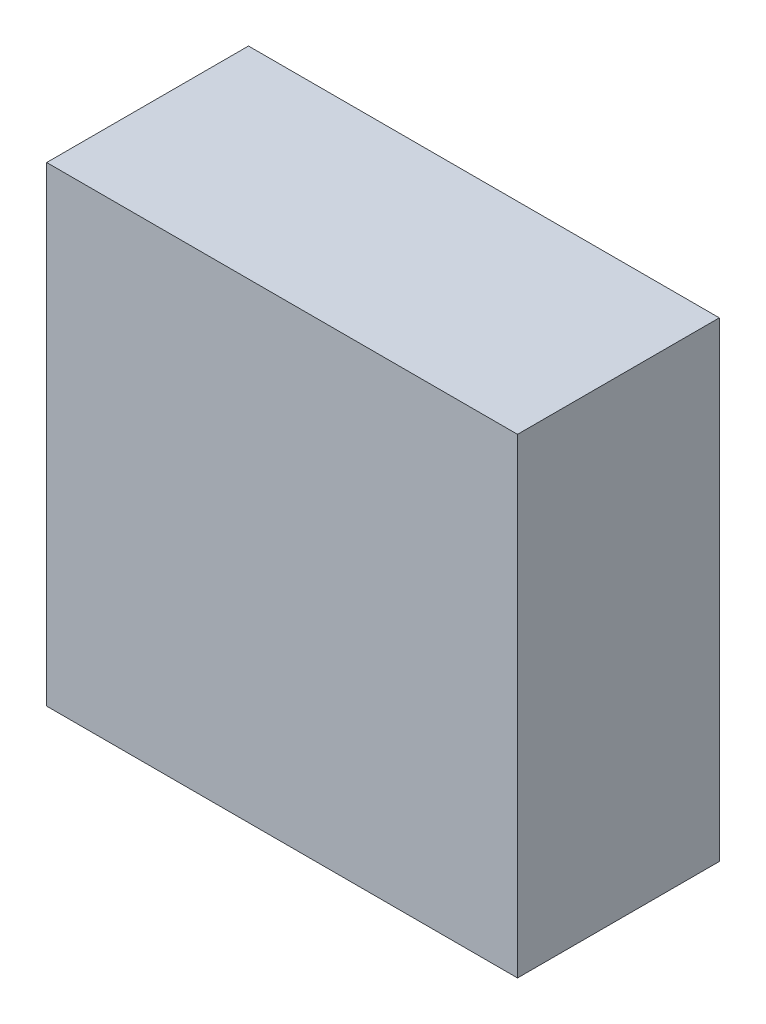
ISO-10303-21;
HEADER;
FILE_DESCRIPTION(('STEP AP214'),'2;1');
FILE_NAME('part.step','',(''),(''),'','','');
FILE_SCHEMA(('AUTOMOTIVE_DESIGN { 1 0 10303 214 1 1 1 1 }'));
ENDSEC;
DATA;
#1=APPLICATION_CONTEXT('core data for automotive mechanical design processes');
#2=APPLICATION_PROTOCOL_DEFINITION('international standard','automotive_design',2000,#1);
#3=PRODUCT_CONTEXT('',#1,'mechanical');
#4=PRODUCT('Part','Part','',(#3));
#5=PRODUCT_RELATED_PRODUCT_CATEGORY('part','',(#4));
#6=PRODUCT_DEFINITION_FORMATION('','',#4);
#7=PRODUCT_DEFINITION_CONTEXT('part definition',#1,'design');
#8=PRODUCT_DEFINITION('design','',#6,#7);
#9=PRODUCT_DEFINITION_SHAPE('','',#8);
#10=(LENGTH_UNIT() NAMED_UNIT(*) SI_UNIT(.MILLI.,.METRE.));
#11=(NAMED_UNIT(*) PLANE_ANGLE_UNIT() SI_UNIT($,.RADIAN.));
#12=(NAMED_UNIT(*) SI_UNIT($,.STERADIAN.) SOLID_ANGLE_UNIT());
#13=UNCERTAINTY_MEASURE_WITH_UNIT(LENGTH_MEASURE(1.E-05),#10,'distance_accuracy_value','');
#14=(GEOMETRIC_REPRESENTATION_CONTEXT(3) GLOBAL_UNCERTAINTY_ASSIGNED_CONTEXT((#13)) GLOBAL_UNIT_ASSIGNED_CONTEXT((#10,
#11,#12)) REPRESENTATION_CONTEXT('',''));
#15=CARTESIAN_POINT('',(0.,0.,0.));
#16=DIRECTION('',(0.,0.,1.));
#17=DIRECTION('',(1.,0.,0.));
#18=AXIS2_PLACEMENT_3D('',#15,#16,#17);
#19=CARTESIAN_POINT('',(0.,0.,15.));
#20=DIRECTION('',(0.,0.,1.));
#21=DIRECTION('',(1.,0.,0.));
#22=AXIS2_PLACEMENT_3D('',#19,#20,#21);
#23=PLANE('',#22);
#24=DIRECTION('',(-1.,0.,0.));
#25=VECTOR('',#24,1.);
#26=CARTESIAN_POINT('',(0.,-17.5,15.));
#27=LINE('',#26,#25);
#28=CARTESIAN_POINT('',(17.5,-17.5,15.));
#29=VERTEX_POINT('',#28);
#30=CARTESIAN_POINT('',(-17.5,-17.5,15.));
#31=VERTEX_POINT('',#30);
#32=EDGE_CURVE('E11',#29,#31,#27,.T.);
#33=ORIENTED_EDGE('',*,*,#32,.F.);
#34=DIRECTION('',(0.,-1.,0.));
#35=VECTOR('',#34,1.);
#36=CARTESIAN_POINT('',(17.5,0.,15.));
#37=LINE('',#36,#35);
#38=CARTESIAN_POINT('',(17.5,17.5,15.));
#39=VERTEX_POINT('',#38);
#40=EDGE_CURVE('E61',#39,#29,#37,.T.);
#41=ORIENTED_EDGE('',*,*,#40,.F.);
#42=DIRECTION('',(1.,0.,0.));
#43=VECTOR('',#42,1.);
#44=CARTESIAN_POINT('',(0.,17.5,15.));
#45=LINE('',#44,#43);
#46=CARTESIAN_POINT('',(-17.5,17.5,15.));
#47=VERTEX_POINT('',#46);
#48=EDGE_CURVE('E87',#47,#39,#45,.T.);
#49=ORIENTED_EDGE('',*,*,#48,.F.);
#50=DIRECTION('',(0.,1.,0.));
#51=VECTOR('',#50,1.);
#52=CARTESIAN_POINT('',(-17.5,0.,15.));
#53=LINE('',#52,#51);
#54=EDGE_CURVE('E24',#31,#47,#53,.T.);
#55=ORIENTED_EDGE('',*,*,#54,.F.);
#56=EDGE_LOOP('',(#33,#41,#49,#55));
#57=FACE_BOUND('',#56,.T.);
#58=ADVANCED_FACE('F17',(#57),#23,.T.);
#59=CARTESIAN_POINT('',(0.,-17.5,0.));
#60=DIRECTION('',(0.,-1.,0.));
#61=DIRECTION('',(0.,0.,-1.));
#62=AXIS2_PLACEMENT_3D('',#59,#60,#61);
#63=PLANE('',#62);
#64=DIRECTION('',(0.,0.,1.));
#65=VECTOR('',#64,1.);
#66=CARTESIAN_POINT('',(17.5,-17.5,0.));
#67=LINE('',#66,#65);
#68=CARTESIAN_POINT('',(17.5,-17.5,0.));
#69=VERTEX_POINT('',#68);
#70=EDGE_CURVE('E53',#69,#29,#67,.T.);
#71=ORIENTED_EDGE('',*,*,#70,.T.);
#72=ORIENTED_EDGE('',*,*,#32,.T.);
#73=DIRECTION('',(0.,0.,1.));
#74=VECTOR('',#73,1.);
#75=CARTESIAN_POINT('',(-17.5,-17.5,0.));
#76=LINE('',#75,#74);
#77=CARTESIAN_POINT('',(-17.5,-17.5,0.));
#78=VERTEX_POINT('',#77);
#79=EDGE_CURVE('E70',#78,#31,#76,.T.);
#80=ORIENTED_EDGE('',*,*,#79,.F.);
#81=DIRECTION('',(1.,0.,0.));
#82=VECTOR('',#81,1.);
#83=CARTESIAN_POINT('',(0.,-17.5,0.));
#84=LINE('',#83,#82);
#85=EDGE_CURVE('E65',#78,#69,#84,.T.);
#86=ORIENTED_EDGE('',*,*,#85,.T.);
#87=EDGE_LOOP('',(#71,#72,#80,#86));
#88=FACE_BOUND('',#87,.T.);
#89=ADVANCED_FACE('F66',(#88),#63,.T.);
#90=CARTESIAN_POINT('',(-17.5,0.,0.));
#91=DIRECTION('',(-1.,0.,0.));
#92=DIRECTION('',(0.,0.,1.));
#93=AXIS2_PLACEMENT_3D('',#90,#91,#92);
#94=PLANE('',#93);
#95=ORIENTED_EDGE('',*,*,#79,.T.);
#96=ORIENTED_EDGE('',*,*,#54,.T.);
#97=DIRECTION('',(0.,0.,1.));
#98=VECTOR('',#97,1.);
#99=CARTESIAN_POINT('',(-17.5,17.5,0.));
#100=LINE('',#99,#98);
#101=CARTESIAN_POINT('',(-17.5,17.5,0.));
#102=VERTEX_POINT('',#101);
#103=EDGE_CURVE('E85',#102,#47,#100,.T.);
#104=ORIENTED_EDGE('',*,*,#103,.F.);
#105=DIRECTION('',(0.,-1.,0.));
#106=VECTOR('',#105,1.);
#107=CARTESIAN_POINT('',(-17.5,0.,0.));
#108=LINE('',#107,#106);
#109=EDGE_CURVE('E75',#102,#78,#108,.T.);
#110=ORIENTED_EDGE('',*,*,#109,.T.);
#111=EDGE_LOOP('',(#95,#96,#104,#110));
#112=FACE_BOUND('',#111,.T.);
#113=ADVANCED_FACE('F93',(#112),#94,.T.);
#114=CARTESIAN_POINT('',(0.,17.5,0.));
#115=DIRECTION('',(0.,1.,0.));
#116=DIRECTION('',(0.,0.,1.));
#117=AXIS2_PLACEMENT_3D('',#114,#115,#116);
#118=PLANE('',#117);
#119=ORIENTED_EDGE('',*,*,#103,.T.);
#120=ORIENTED_EDGE('',*,*,#48,.T.);
#121=DIRECTION('',(0.,0.,1.));
#122=VECTOR('',#121,1.);
#123=CARTESIAN_POINT('',(17.5,17.5,0.));
#124=LINE('',#123,#122);
#125=CARTESIAN_POINT('',(17.5,17.5,0.));
#126=VERTEX_POINT('',#125);
#127=EDGE_CURVE('E62',#126,#39,#124,.T.);
#128=ORIENTED_EDGE('',*,*,#127,.F.);
#129=DIRECTION('',(-1.,0.,0.));
#130=VECTOR('',#129,1.);
#131=CARTESIAN_POINT('',(0.,17.5,0.));
#132=LINE('',#131,#130);
#133=EDGE_CURVE('E76',#126,#102,#132,.T.);
#134=ORIENTED_EDGE('',*,*,#133,.T.);
#135=EDGE_LOOP('',(#119,#120,#128,#134));
#136=FACE_BOUND('',#135,.T.);
#137=ADVANCED_FACE('F90',(#136),#118,.T.);
#138=CARTESIAN_POINT('',(0.,0.,0.));
#139=DIRECTION('',(0.,0.,-1.));
#140=DIRECTION('',(-1.,0.,0.));
#141=AXIS2_PLACEMENT_3D('',#138,#139,#140);
#142=PLANE('',#141);
#143=DIRECTION('',(0.,1.,0.));
#144=VECTOR('',#143,1.);
#145=CARTESIAN_POINT('',(17.5,0.,0.));
#146=LINE('',#145,#144);
#147=EDGE_CURVE('E56',#69,#126,#146,.T.);
#148=ORIENTED_EDGE('',*,*,#147,.F.);
#149=ORIENTED_EDGE('',*,*,#85,.F.);
#150=ORIENTED_EDGE('',*,*,#109,.F.);
#151=ORIENTED_EDGE('',*,*,#133,.F.);
#152=EDGE_LOOP('',(#148,#149,#150,#151));
#153=FACE_BOUND('',#152,.T.);
#154=ADVANCED_FACE('F72',(#153),#142,.T.);
#155=CARTESIAN_POINT('',(17.5,0.,0.));
#156=DIRECTION('',(1.,0.,0.));
#157=DIRECTION('',(0.,0.,-1.));
#158=AXIS2_PLACEMENT_3D('',#155,#156,#157);
#159=PLANE('',#158);
#160=ORIENTED_EDGE('',*,*,#147,.T.);
#161=ORIENTED_EDGE('',*,*,#127,.T.);
#162=ORIENTED_EDGE('',*,*,#40,.T.);
#163=ORIENTED_EDGE('',*,*,#70,.F.);
#164=EDGE_LOOP('',(#160,#161,#162,#163));
#165=FACE_BOUND('',#164,.T.);
#166=ADVANCED_FACE('F57',(#165),#159,.T.);
#167=CLOSED_SHELL('',(#58,#89,#113,#137,#154,#166));
#168=MANIFOLD_SOLID_BREP('B1',#167);
#169=ADVANCED_BREP_SHAPE_REPRESENTATION('',(#18,#168),#14);
#170=SHAPE_DEFINITION_REPRESENTATION(#9,#169);
ENDSEC;
END-ISO-10303-21;
